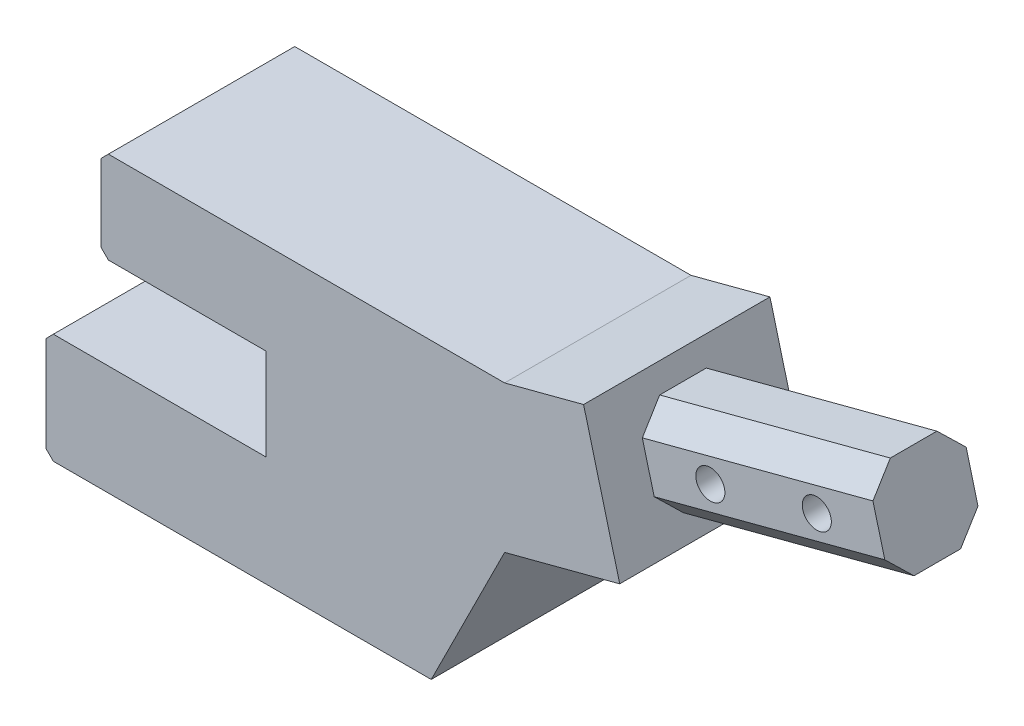
ISO-10303-21;
HEADER;
FILE_DESCRIPTION(('STEP AP214'),'2;1');
FILE_NAME('part.step','',(''),(''),'','','');
FILE_SCHEMA(('AUTOMOTIVE_DESIGN { 1 0 10303 214 1 1 1 1 }'));
ENDSEC;
DATA;
#1=APPLICATION_CONTEXT('core data for automotive mechanical design processes');
#2=APPLICATION_PROTOCOL_DEFINITION('international standard','automotive_design',2000,#1);
#3=PRODUCT_CONTEXT('',#1,'mechanical');
#4=PRODUCT('Part','Part','',(#3));
#5=PRODUCT_RELATED_PRODUCT_CATEGORY('part','',(#4));
#6=PRODUCT_DEFINITION_FORMATION('','',#4);
#7=PRODUCT_DEFINITION_CONTEXT('part definition',#1,'design');
#8=PRODUCT_DEFINITION('design','',#6,#7);
#9=PRODUCT_DEFINITION_SHAPE('','',#8);
#10=(LENGTH_UNIT() NAMED_UNIT(*) SI_UNIT(.MILLI.,.METRE.));
#11=(NAMED_UNIT(*) PLANE_ANGLE_UNIT() SI_UNIT($,.RADIAN.));
#12=(NAMED_UNIT(*) SI_UNIT($,.STERADIAN.) SOLID_ANGLE_UNIT());
#13=UNCERTAINTY_MEASURE_WITH_UNIT(LENGTH_MEASURE(1.E-05),#10,'distance_accuracy_value','');
#14=(GEOMETRIC_REPRESENTATION_CONTEXT(3) GLOBAL_UNCERTAINTY_ASSIGNED_CONTEXT((#13)) GLOBAL_UNIT_ASSIGNED_CONTEXT((#10,
#11,#12)) REPRESENTATION_CONTEXT('',''));
#15=CARTESIAN_POINT('',(0.,0.,0.));
#16=DIRECTION('',(0.,0.,1.));
#17=DIRECTION('',(1.,0.,0.));
#18=AXIS2_PLACEMENT_3D('',#15,#16,#17);
#19=CARTESIAN_POINT('',(0.,40.,25.4));
#20=DIRECTION('',(0.254493520450265,-0.967074479059824,0.));
#21=DIRECTION('',(0.967074479059824,0.254493520450265,0.));
#22=AXIS2_PLACEMENT_3D('',#19,#20,#21);
#23=PLANE('',#22);
#24=DIRECTION('',(-0.967074479059824,-0.254493520450265,0.));
#25=VECTOR('',#24,1.);
#26=CARTESIAN_POINT('',(0.,40.,-25.4));
#27=LINE('',#26,#25);
#28=CARTESIAN_POINT('',(21.5228,45.6639,-25.4));
#29=VERTEX_POINT('',#28);
#30=CARTESIAN_POINT('',(0.,40.,-25.4));
#31=VERTEX_POINT('',#30);
#32=EDGE_CURVE('E217',#29,#31,#27,.T.);
#33=ORIENTED_EDGE('',*,*,#32,.T.);
#34=DIRECTION('',(0.,0.,-1.));
#35=VECTOR('',#34,1.);
#36=CARTESIAN_POINT('',(0.,40.,25.4));
#37=LINE('',#36,#35);
#38=CARTESIAN_POINT('',(0.,40.,25.4));
#39=VERTEX_POINT('',#38);
#40=EDGE_CURVE('E198',#39,#31,#37,.T.);
#41=ORIENTED_EDGE('',*,*,#40,.F.);
#42=DIRECTION('',(-0.967074479059824,-0.254493520450265,0.));
#43=VECTOR('',#42,1.);
#44=CARTESIAN_POINT('',(0.,40.,25.4));
#45=LINE('',#44,#43);
#46=CARTESIAN_POINT('',(21.5228,45.6639,25.4));
#47=VERTEX_POINT('',#46);
#48=EDGE_CURVE('E205',#47,#39,#45,.T.);
#49=ORIENTED_EDGE('',*,*,#48,.F.);
#50=DIRECTION('',(0.,0.,-1.));
#51=VECTOR('',#50,1.);
#52=CARTESIAN_POINT('',(21.5228,45.6639,25.4));
#53=LINE('',#52,#51);
#54=EDGE_CURVE('E320',#47,#29,#53,.T.);
#55=ORIENTED_EDGE('',*,*,#54,.T.);
#56=EDGE_LOOP('',(#33,#41,#49,#55));
#57=FACE_BOUND('',#56,.T.);
#58=ADVANCED_FACE('F39',(#57),#23,.F.);
#59=CARTESIAN_POINT('',(-108.006473463206,40.,25.4));
#60=DIRECTION('',(0.,-1.,0.));
#61=DIRECTION('',(1.,0.,0.));
#62=AXIS2_PLACEMENT_3D('',#59,#60,#61);
#63=PLANE('',#62);
#64=DIRECTION('',(-1.,0.,0.));
#65=VECTOR('',#64,1.);
#66=CARTESIAN_POINT('',(-108.006473463206,40.,-25.4));
#67=LINE('',#66,#65);
#68=CARTESIAN_POINT('',(-108.006473463206,40.,-25.4));
#69=VERTEX_POINT('',#68);
#70=EDGE_CURVE('E322',#31,#69,#67,.T.);
#71=ORIENTED_EDGE('',*,*,#70,.T.);
#72=DIRECTION('',(0.,0.,-1.));
#73=VECTOR('',#72,1.);
#74=CARTESIAN_POINT('',(-108.006473463206,40.,25.4));
#75=LINE('',#74,#73);
#76=CARTESIAN_POINT('',(-108.006473463206,40.,25.4));
#77=VERTEX_POINT('',#76);
#78=EDGE_CURVE('E201',#77,#69,#75,.T.);
#79=ORIENTED_EDGE('',*,*,#78,.F.);
#80=DIRECTION('',(-1.,0.,0.));
#81=VECTOR('',#80,1.);
#82=CARTESIAN_POINT('',(-108.006473463206,40.,25.4));
#83=LINE('',#82,#81);
#84=EDGE_CURVE('E194',#39,#77,#83,.T.);
#85=ORIENTED_EDGE('',*,*,#84,.F.);
#86=ORIENTED_EDGE('',*,*,#40,.T.);
#87=EDGE_LOOP('',(#71,#79,#85,#86));
#88=FACE_BOUND('',#87,.T.);
#89=ADVANCED_FACE('F196',(#88),#63,.F.);
#90=CARTESIAN_POINT('',(-110.,37.9935265367935,25.4));
#91=DIRECTION('',(0.709391780114608,-0.704814374360957,0.));
#92=DIRECTION('',(0.704814374360957,0.709391780114608,0.));
#93=AXIS2_PLACEMENT_3D('',#90,#91,#92);
#94=PLANE('',#93);
#95=DIRECTION('',(-0.704814374360957,-0.709391780114608,0.));
#96=VECTOR('',#95,1.);
#97=CARTESIAN_POINT('',(-110.,37.9935265367935,-25.4));
#98=LINE('',#97,#96);
#99=CARTESIAN_POINT('',(-110.,37.9935265367935,-25.4));
#100=VERTEX_POINT('',#99);
#101=EDGE_CURVE('E324',#69,#100,#98,.T.);
#102=ORIENTED_EDGE('',*,*,#101,.T.);
#103=DIRECTION('',(0.,0.,-1.));
#104=VECTOR('',#103,1.);
#105=CARTESIAN_POINT('',(-110.,37.9935265367935,25.4));
#106=LINE('',#105,#104);
#107=CARTESIAN_POINT('',(-110.,37.9935265367935,25.4));
#108=VERTEX_POINT('',#107);
#109=EDGE_CURVE('E222',#108,#100,#106,.T.);
#110=ORIENTED_EDGE('',*,*,#109,.F.);
#111=DIRECTION('',(-0.704814374360957,-0.709391780114608,0.));
#112=VECTOR('',#111,1.);
#113=CARTESIAN_POINT('',(-110.,37.9935265367935,25.4));
#114=LINE('',#113,#112);
#115=EDGE_CURVE('E204',#77,#108,#114,.T.);
#116=ORIENTED_EDGE('',*,*,#115,.F.);
#117=ORIENTED_EDGE('',*,*,#78,.T.);
#118=EDGE_LOOP('',(#102,#110,#116,#117));
#119=FACE_BOUND('',#118,.T.);
#120=ADVANCED_FACE('F406',(#119),#94,.F.);
#121=CARTESIAN_POINT('',(-110.,16.9935265367937,25.4));
#122=DIRECTION('',(1.,0.,0.));
#123=DIRECTION('',(0.,0.,-1.));
#124=AXIS2_PLACEMENT_3D('',#121,#122,#123);
#125=PLANE('',#124);
#126=DIRECTION('',(0.,-1.,0.));
#127=VECTOR('',#126,1.);
#128=CARTESIAN_POINT('',(-110.,16.9935265367937,-25.4));
#129=LINE('',#128,#127);
#130=CARTESIAN_POINT('',(-110.,16.9935265367937,-25.4));
#131=VERTEX_POINT('',#130);
#132=EDGE_CURVE('E326',#100,#131,#129,.T.);
#133=ORIENTED_EDGE('',*,*,#132,.T.);
#134=DIRECTION('',(0.,0.,-1.));
#135=VECTOR('',#134,1.);
#136=CARTESIAN_POINT('',(-110.,16.9935265367937,25.4));
#137=LINE('',#136,#135);
#138=CARTESIAN_POINT('',(-110.,16.9935265367937,25.4));
#139=VERTEX_POINT('',#138);
#140=EDGE_CURVE('E380',#139,#131,#137,.T.);
#141=ORIENTED_EDGE('',*,*,#140,.F.);
#142=DIRECTION('',(0.,-1.,0.));
#143=VECTOR('',#142,1.);
#144=CARTESIAN_POINT('',(-110.,16.9935265367937,25.4));
#145=LINE('',#144,#143);
#146=EDGE_CURVE('E297',#108,#139,#145,.T.);
#147=ORIENTED_EDGE('',*,*,#146,.F.);
#148=ORIENTED_EDGE('',*,*,#109,.T.);
#149=EDGE_LOOP('',(#133,#141,#147,#148));
#150=FACE_BOUND('',#149,.T.);
#151=ADVANCED_FACE('F387',(#150),#125,.F.);
#152=CARTESIAN_POINT('',(-107.993526536793,15.,25.4));
#153=DIRECTION('',(0.704814374360958,0.709391780114607,0.));
#154=DIRECTION('',(-0.709391780114607,0.704814374360958,0.));
#155=AXIS2_PLACEMENT_3D('',#152,#153,#154);
#156=PLANE('',#155);
#157=DIRECTION('',(0.709391780114607,-0.704814374360958,0.));
#158=VECTOR('',#157,1.);
#159=CARTESIAN_POINT('',(-107.993526536793,15.,-25.4));
#160=LINE('',#159,#158);
#161=CARTESIAN_POINT('',(-107.993526536793,15.,-25.4));
#162=VERTEX_POINT('',#161);
#163=EDGE_CURVE('E328',#131,#162,#160,.T.);
#164=ORIENTED_EDGE('',*,*,#163,.T.);
#165=DIRECTION('',(0.,0.,-1.));
#166=VECTOR('',#165,1.);
#167=CARTESIAN_POINT('',(-107.993526536793,15.,25.4));
#168=LINE('',#167,#166);
#169=CARTESIAN_POINT('',(-107.993526536793,15.,25.4));
#170=VERTEX_POINT('',#169);
#171=EDGE_CURVE('E377',#170,#162,#168,.T.);
#172=ORIENTED_EDGE('',*,*,#171,.F.);
#173=DIRECTION('',(0.709391780114607,-0.704814374360958,0.));
#174=VECTOR('',#173,1.);
#175=CARTESIAN_POINT('',(-107.993526536793,15.,25.4));
#176=LINE('',#175,#174);
#177=EDGE_CURVE('E299',#139,#170,#176,.T.);
#178=ORIENTED_EDGE('',*,*,#177,.F.);
#179=ORIENTED_EDGE('',*,*,#140,.T.);
#180=EDGE_LOOP('',(#164,#172,#178,#179));
#181=FACE_BOUND('',#180,.T.);
#182=ADVANCED_FACE('F398',(#181),#156,.F.);
#183=CARTESIAN_POINT('',(-65.0000832715242,15.,25.4));
#184=DIRECTION('',(0.,1.,0.));
#185=DIRECTION('',(-1.,0.,0.));
#186=AXIS2_PLACEMENT_3D('',#183,#184,#185);
#187=PLANE('',#186);
#188=DIRECTION('',(1.,0.,0.));
#189=VECTOR('',#188,1.);
#190=CARTESIAN_POINT('',(-65.0000832715242,15.,-25.4));
#191=LINE('',#190,#189);
#192=CARTESIAN_POINT('',(-65.0000832715242,15.,-25.4));
#193=VERTEX_POINT('',#192);
#194=EDGE_CURVE('E330',#162,#193,#191,.T.);
#195=ORIENTED_EDGE('',*,*,#194,.T.);
#196=DIRECTION('',(0.,0.,-1.));
#197=VECTOR('',#196,1.);
#198=CARTESIAN_POINT('',(-65.0000832715242,15.,25.4));
#199=LINE('',#198,#197);
#200=CARTESIAN_POINT('',(-65.0000832715242,15.,25.4));
#201=VERTEX_POINT('',#200);
#202=EDGE_CURVE('E374',#201,#193,#199,.T.);
#203=ORIENTED_EDGE('',*,*,#202,.F.);
#204=DIRECTION('',(1.,0.,0.));
#205=VECTOR('',#204,1.);
#206=CARTESIAN_POINT('',(-65.0000832715242,15.,25.4));
#207=LINE('',#206,#205);
#208=EDGE_CURVE('E301',#170,#201,#207,.T.);
#209=ORIENTED_EDGE('',*,*,#208,.F.);
#210=ORIENTED_EDGE('',*,*,#171,.T.);
#211=EDGE_LOOP('',(#195,#203,#209,#210));
#212=FACE_BOUND('',#211,.T.);
#213=ADVANCED_FACE('F402',(#212),#187,.F.);
#214=CARTESIAN_POINT('',(-65.0000832715242,-10.,25.4));
#215=DIRECTION('',(1.,0.,0.));
#216=DIRECTION('',(0.,1.,0.));
#217=AXIS2_PLACEMENT_3D('',#214,#215,#216);
#218=PLANE('',#217);
#219=DIRECTION('',(0.,-1.,0.));
#220=VECTOR('',#219,1.);
#221=CARTESIAN_POINT('',(-65.0000832715242,-10.,-25.4));
#222=LINE('',#221,#220);
#223=CARTESIAN_POINT('',(-65.0000832715242,-10.,-25.4));
#224=VERTEX_POINT('',#223);
#225=EDGE_CURVE('E332',#193,#224,#222,.T.);
#226=ORIENTED_EDGE('',*,*,#225,.T.);
#227=DIRECTION('',(0.,0.,-1.));
#228=VECTOR('',#227,1.);
#229=CARTESIAN_POINT('',(-65.0000832715242,-10.,25.4));
#230=LINE('',#229,#228);
#231=CARTESIAN_POINT('',(-65.0000832715242,-10.,25.4));
#232=VERTEX_POINT('',#231);
#233=EDGE_CURVE('E371',#232,#224,#230,.T.);
#234=ORIENTED_EDGE('',*,*,#233,.F.);
#235=DIRECTION('',(0.,-1.,0.));
#236=VECTOR('',#235,1.);
#237=CARTESIAN_POINT('',(-65.0000832715242,-10.,25.4));
#238=LINE('',#237,#236);
#239=EDGE_CURVE('E303',#201,#232,#238,.T.);
#240=ORIENTED_EDGE('',*,*,#239,.F.);
#241=ORIENTED_EDGE('',*,*,#202,.T.);
#242=EDGE_LOOP('',(#226,#234,#240,#241));
#243=FACE_BOUND('',#242,.T.);
#244=ADVANCED_FACE('F521',(#243),#218,.F.);
#245=CARTESIAN_POINT('',(-123.000083271524,-10.,25.4));
#246=DIRECTION('',(0.,-1.,0.));
#247=DIRECTION('',(1.,0.,0.));
#248=AXIS2_PLACEMENT_3D('',#245,#246,#247);
#249=PLANE('',#248);
#250=DIRECTION('',(-1.,0.,0.));
#251=VECTOR('',#250,1.);
#252=CARTESIAN_POINT('',(-123.000083271524,-10.,-25.4));
#253=LINE('',#252,#251);
#254=CARTESIAN_POINT('',(-123.000083271524,-10.,-25.4));
#255=VERTEX_POINT('',#254);
#256=EDGE_CURVE('E334',#224,#255,#253,.T.);
#257=ORIENTED_EDGE('',*,*,#256,.T.);
#258=DIRECTION('',(0.,0.,-1.));
#259=VECTOR('',#258,1.);
#260=CARTESIAN_POINT('',(-123.000083271524,-10.,25.4));
#261=LINE('',#260,#259);
#262=CARTESIAN_POINT('',(-123.000083271524,-10.,25.4));
#263=VERTEX_POINT('',#262);
#264=EDGE_CURVE('E368',#263,#255,#261,.T.);
#265=ORIENTED_EDGE('',*,*,#264,.F.);
#266=DIRECTION('',(-1.,0.,0.));
#267=VECTOR('',#266,1.);
#268=CARTESIAN_POINT('',(-123.000083271524,-10.,25.4));
#269=LINE('',#268,#267);
#270=EDGE_CURVE('E305',#232,#263,#269,.T.);
#271=ORIENTED_EDGE('',*,*,#270,.F.);
#272=ORIENTED_EDGE('',*,*,#233,.T.);
#273=EDGE_LOOP('',(#257,#265,#271,#272));
#274=FACE_BOUND('',#273,.T.);
#275=ADVANCED_FACE('F517',(#274),#249,.F.);
#276=CARTESIAN_POINT('',(-125.,-12.012905155887,25.4));
#277=DIRECTION('',(0.709391780114603,-0.704814374360962,0.));
#278=DIRECTION('',(0.704814374360962,0.709391780114603,0.));
#279=AXIS2_PLACEMENT_3D('',#276,#277,#278);
#280=PLANE('',#279);
#281=DIRECTION('',(-0.704814374360962,-0.709391780114603,0.));
#282=VECTOR('',#281,1.);
#283=CARTESIAN_POINT('',(-125.,-12.012905155887,-25.4));
#284=LINE('',#283,#282);
#285=CARTESIAN_POINT('',(-125.,-12.012905155887,-25.4));
#286=VERTEX_POINT('',#285);
#287=EDGE_CURVE('E336',#255,#286,#284,.T.);
#288=ORIENTED_EDGE('',*,*,#287,.T.);
#289=DIRECTION('',(0.,0.,-1.));
#290=VECTOR('',#289,1.);
#291=CARTESIAN_POINT('',(-125.,-12.012905155887,25.4));
#292=LINE('',#291,#290);
#293=CARTESIAN_POINT('',(-125.,-12.012905155887,25.4));
#294=VERTEX_POINT('',#293);
#295=EDGE_CURVE('E365',#294,#286,#292,.T.);
#296=ORIENTED_EDGE('',*,*,#295,.F.);
#297=DIRECTION('',(-0.704814374360962,-0.709391780114603,0.));
#298=VECTOR('',#297,1.);
#299=CARTESIAN_POINT('',(-125.,-12.012905155887,25.4));
#300=LINE('',#299,#298);
#301=EDGE_CURVE('E307',#263,#294,#300,.T.);
#302=ORIENTED_EDGE('',*,*,#301,.F.);
#303=ORIENTED_EDGE('',*,*,#264,.T.);
#304=EDGE_LOOP('',(#288,#296,#302,#303));
#305=FACE_BOUND('',#304,.T.);
#306=ADVANCED_FACE('F513',(#305),#280,.F.);
#307=CARTESIAN_POINT('',(-125.,-38.012905155887,25.4));
#308=DIRECTION('',(1.,0.,0.));
#309=DIRECTION('',(0.,0.,-1.));
#310=AXIS2_PLACEMENT_3D('',#307,#308,#309);
#311=PLANE('',#310);
#312=DIRECTION('',(0.,-1.,0.));
#313=VECTOR('',#312,1.);
#314=CARTESIAN_POINT('',(-125.,-38.012905155887,-25.4));
#315=LINE('',#314,#313);
#316=CARTESIAN_POINT('',(-125.,-38.012905155887,-25.4));
#317=VERTEX_POINT('',#316);
#318=EDGE_CURVE('E338',#286,#317,#315,.T.);
#319=ORIENTED_EDGE('',*,*,#318,.T.);
#320=DIRECTION('',(0.,0.,-1.));
#321=VECTOR('',#320,1.);
#322=CARTESIAN_POINT('',(-125.,-38.012905155887,25.4));
#323=LINE('',#322,#321);
#324=CARTESIAN_POINT('',(-125.,-38.012905155887,25.4));
#325=VERTEX_POINT('',#324);
#326=EDGE_CURVE('E362',#325,#317,#323,.T.);
#327=ORIENTED_EDGE('',*,*,#326,.F.);
#328=DIRECTION('',(0.,-1.,0.));
#329=VECTOR('',#328,1.);
#330=CARTESIAN_POINT('',(-125.,-38.012905155887,25.4));
#331=LINE('',#330,#329);
#332=EDGE_CURVE('E309',#294,#325,#331,.T.);
#333=ORIENTED_EDGE('',*,*,#332,.F.);
#334=ORIENTED_EDGE('',*,*,#295,.T.);
#335=EDGE_LOOP('',(#319,#327,#333,#334));
#336=FACE_BOUND('',#335,.T.);
#337=ADVANCED_FACE('F509',(#336),#311,.F.);
#338=CARTESIAN_POINT('',(-123.,-40.,25.4));
#339=DIRECTION('',(0.704814374360949,0.709391780114616,0.));
#340=DIRECTION('',(-0.709391780114616,0.704814374360949,0.));
#341=AXIS2_PLACEMENT_3D('',#338,#339,#340);
#342=PLANE('',#341);
#343=DIRECTION('',(0.709391780114616,-0.704814374360949,0.));
#344=VECTOR('',#343,1.);
#345=CARTESIAN_POINT('',(-123.,-40.,-25.4));
#346=LINE('',#345,#344);
#347=CARTESIAN_POINT('',(-123.,-40.,-25.4));
#348=VERTEX_POINT('',#347);
#349=EDGE_CURVE('E340',#317,#348,#346,.T.);
#350=ORIENTED_EDGE('',*,*,#349,.T.);
#351=DIRECTION('',(0.,0.,-1.));
#352=VECTOR('',#351,1.);
#353=CARTESIAN_POINT('',(-123.,-40.,25.4));
#354=LINE('',#353,#352);
#355=CARTESIAN_POINT('',(-123.,-40.,25.4));
#356=VERTEX_POINT('',#355);
#357=EDGE_CURVE('E359',#356,#348,#354,.T.);
#358=ORIENTED_EDGE('',*,*,#357,.F.);
#359=DIRECTION('',(0.709391780114616,-0.704814374360949,0.));
#360=VECTOR('',#359,1.);
#361=CARTESIAN_POINT('',(-123.,-40.,25.4));
#362=LINE('',#361,#360);
#363=EDGE_CURVE('E311',#325,#356,#362,.T.);
#364=ORIENTED_EDGE('',*,*,#363,.F.);
#365=ORIENTED_EDGE('',*,*,#326,.T.);
#366=EDGE_LOOP('',(#350,#358,#364,#365));
#367=FACE_BOUND('',#366,.T.);
#368=ADVANCED_FACE('F505',(#367),#342,.F.);
#369=CARTESIAN_POINT('',(-20.,-40.,25.4));
#370=DIRECTION('',(0.,1.,0.));
#371=DIRECTION('',(-1.,0.,0.));
#372=AXIS2_PLACEMENT_3D('',#369,#370,#371);
#373=PLANE('',#372);
#374=DIRECTION('',(1.,0.,0.));
#375=VECTOR('',#374,1.);
#376=CARTESIAN_POINT('',(-20.,-40.,-25.4));
#377=LINE('',#376,#375);
#378=CARTESIAN_POINT('',(-20.,-40.,-25.4));
#379=VERTEX_POINT('',#378);
#380=EDGE_CURVE('E342',#348,#379,#377,.T.);
#381=ORIENTED_EDGE('',*,*,#380,.T.);
#382=DIRECTION('',(0.,0.,-1.));
#383=VECTOR('',#382,1.);
#384=CARTESIAN_POINT('',(-20.,-40.,25.4));
#385=LINE('',#384,#383);
#386=CARTESIAN_POINT('',(-20.,-40.,25.4));
#387=VERTEX_POINT('',#386);
#388=EDGE_CURVE('E356',#387,#379,#385,.T.);
#389=ORIENTED_EDGE('',*,*,#388,.F.);
#390=DIRECTION('',(1.,0.,0.));
#391=VECTOR('',#390,1.);
#392=CARTESIAN_POINT('',(-20.,-40.,25.4));
#393=LINE('',#392,#391);
#394=EDGE_CURVE('E313',#356,#387,#393,.T.);
#395=ORIENTED_EDGE('',*,*,#394,.F.);
#396=ORIENTED_EDGE('',*,*,#357,.T.);
#397=EDGE_LOOP('',(#381,#389,#395,#396));
#398=FACE_BOUND('',#397,.T.);
#399=ADVANCED_FACE('F501',(#398),#373,.F.);
#400=CARTESIAN_POINT('',(0.,0.,25.4));
#401=DIRECTION('',(-0.894427190999916,0.447213595499958,0.));
#402=DIRECTION('',(-0.447213595499958,-0.894427190999916,0.));
#403=AXIS2_PLACEMENT_3D('',#400,#401,#402);
#404=PLANE('',#403);
#405=DIRECTION('',(0.447213595499958,0.894427190999916,0.));
#406=VECTOR('',#405,1.);
#407=CARTESIAN_POINT('',(0.,0.,-25.4));
#408=LINE('',#407,#406);
#409=CARTESIAN_POINT('',(0.,0.,-25.4));
#410=VERTEX_POINT('',#409);
#411=EDGE_CURVE('E344',#379,#410,#408,.T.);
#412=ORIENTED_EDGE('',*,*,#411,.T.);
#413=DIRECTION('',(0.,0.,-1.));
#414=VECTOR('',#413,1.);
#415=CARTESIAN_POINT('',(0.,0.,25.4));
#416=LINE('',#415,#414);
#417=CARTESIAN_POINT('',(0.,0.,25.4));
#418=VERTEX_POINT('',#417);
#419=EDGE_CURVE('E353',#418,#410,#416,.T.);
#420=ORIENTED_EDGE('',*,*,#419,.F.);
#421=DIRECTION('',(0.447213595499958,0.894427190999916,0.));
#422=VECTOR('',#421,1.);
#423=CARTESIAN_POINT('',(0.,0.,25.4));
#424=LINE('',#423,#422);
#425=EDGE_CURVE('E315',#387,#418,#424,.T.);
#426=ORIENTED_EDGE('',*,*,#425,.F.);
#427=ORIENTED_EDGE('',*,*,#388,.T.);
#428=EDGE_LOOP('',(#412,#420,#426,#427));
#429=FACE_BOUND('',#428,.T.);
#430=ADVANCED_FACE('F497',(#429),#404,.F.);
#431=CARTESIAN_POINT('',(31.3673983712328,8.25458618928888,25.4));
#432=DIRECTION('',(-0.254493520450265,0.967074479059824,0.));
#433=DIRECTION('',(-0.967074479059824,-0.254493520450265,0.));
#434=AXIS2_PLACEMENT_3D('',#431,#432,#433);
#435=PLANE('',#434);
#436=DIRECTION('',(0.967074479059824,0.254493520450265,0.));
#437=VECTOR('',#436,1.);
#438=CARTESIAN_POINT('',(31.3673983712328,8.25458618928888,-25.4));
#439=LINE('',#438,#437);
#440=CARTESIAN_POINT('',(31.3673983712328,8.25458618928888,-25.4));
#441=VERTEX_POINT('',#440);
#442=EDGE_CURVE('E346',#410,#441,#439,.T.);
#443=ORIENTED_EDGE('',*,*,#442,.T.);
#444=DIRECTION('',(0.,0.,-1.));
#445=VECTOR('',#444,1.);
#446=CARTESIAN_POINT('',(31.3673983712328,8.25458618928888,25.4));
#447=LINE('',#446,#445);
#448=CARTESIAN_POINT('',(31.3673983712328,8.25458618928888,25.4));
#449=VERTEX_POINT('',#448);
#450=EDGE_CURVE('E350',#449,#441,#447,.T.);
#451=ORIENTED_EDGE('',*,*,#450,.F.);
#452=DIRECTION('',(0.967074479059824,0.254493520450265,0.));
#453=VECTOR('',#452,1.);
#454=CARTESIAN_POINT('',(31.3673983712328,8.25458618928888,25.4));
#455=LINE('',#454,#453);
#456=EDGE_CURVE('E317',#418,#449,#455,.T.);
#457=ORIENTED_EDGE('',*,*,#456,.F.);
#458=ORIENTED_EDGE('',*,*,#419,.T.);
#459=EDGE_LOOP('',(#443,#451,#457,#458));
#460=FACE_BOUND('',#459,.T.);
#461=ADVANCED_FACE('F494',(#460),#435,.F.);
#462=CARTESIAN_POINT('',(21.5228,45.6639,25.4));
#463=DIRECTION('',(-0.967074269374455,-0.254494317252593,0.));
#464=DIRECTION('',(0.254494317252593,-0.967074269374455,0.));
#465=AXIS2_PLACEMENT_3D('',#462,#463,#464);
#466=PLANE('',#465);
#467=DIRECTION('',(0.254494317252594,-0.967074269374455,0.));
#468=VECTOR('',#467,1.);
#469=CARTESIAN_POINT('',(23.2130213565085,39.2410863157,12.7));
#470=LINE('',#469,#468);
#471=CARTESIAN_POINT('',(24.8290602710624,33.1001647051723,12.7));
#472=VERTEX_POINT('',#471);
#473=CARTESIAN_POINT('',(28.0611381001704,20.8183214841167,12.7));
#474=VERTEX_POINT('',#473);
#475=EDGE_CURVE('E451',#472,#474,#470,.T.);
#476=ORIENTED_EDGE('',*,*,#475,.F.);
#477=DIRECTION('',(-0.179954657502749,0.683824773785704,-0.707106781186547));
#478=VECTOR('',#477,1.);
#479=CARTESIAN_POINT('',(24.7919690500852,33.2411107420584,12.5542552093985));
#480=LINE('',#479,#478);
#481=CARTESIAN_POINT('',(23.2130213565085,39.2410863157,6.35));
#482=VERTEX_POINT('',#481);
#483=EDGE_CURVE('E13',#472,#482,#480,.T.);
#484=ORIENTED_EDGE('',*,*,#483,.T.);
#485=DIRECTION('',(0.,0.,-1.));
#486=VECTOR('',#485,1.);
#487=CARTESIAN_POINT('',(23.2130213565085,39.2410863157,12.7));
#488=LINE('',#487,#486);
#489=CARTESIAN_POINT('',(23.2130213565085,39.2410863157,-6.34999999999999));
#490=VERTEX_POINT('',#489);
#491=EDGE_CURVE('E266',#482,#490,#488,.T.);
#492=ORIENTED_EDGE('',*,*,#491,.T.);
#493=DIRECTION('',(-0.179954657502749,0.683824773785703,0.707106781186547));
#494=VECTOR('',#493,1.);
#495=CARTESIAN_POINT('',(18.3278133918693,57.8047971841695,12.8457447906015));
#496=LINE('',#495,#494);
#497=CARTESIAN_POINT('',(24.8290602710624,33.1001647051723,-12.7));
#498=VERTEX_POINT('',#497);
#499=EDGE_CURVE('E48',#490,#498,#496,.F.);
#500=ORIENTED_EDGE('',*,*,#499,.T.);
#501=DIRECTION('',(0.254494317252594,-0.967074269374455,0.));
#502=VECTOR('',#501,1.);
#503=CARTESIAN_POINT('',(23.2130213565085,39.2410863157,-12.7));
#504=LINE('',#503,#502);
#505=CARTESIAN_POINT('',(28.0611381001704,20.8183214841167,-12.7));
#506=VERTEX_POINT('',#505);
#507=EDGE_CURVE('E232',#498,#506,#504,.T.);
#508=ORIENTED_EDGE('',*,*,#507,.T.);
#509=DIRECTION('',(-0.179954657502749,0.683824773785703,-0.707106781186548));
#510=VECTOR('',#509,1.);
#511=CARTESIAN_POINT('',(29.6400857937471,14.818345910475,-6.49574479060153));
#512=LINE('',#511,#510);
#513=CARTESIAN_POINT('',(29.6771770147244,14.6773998735889,-6.35));
#514=VERTEX_POINT('',#513);
#515=EDGE_CURVE('E258',#506,#514,#512,.F.);
#516=ORIENTED_EDGE('',*,*,#515,.T.);
#517=DIRECTION('',(0.,0.,-1.));
#518=VECTOR('',#517,1.);
#519=CARTESIAN_POINT('',(29.6771770147244,14.6773998735889,12.7));
#520=LINE('',#519,#518);
#521=CARTESIAN_POINT('',(29.6771770147244,14.6773998735889,6.35));
#522=VERTEX_POINT('',#521);
#523=EDGE_CURVE('E288',#522,#514,#520,.T.);
#524=ORIENTED_EDGE('',*,*,#523,.F.);
#525=DIRECTION('',(-0.179954657502749,0.683824773785703,0.707106781186547));
#526=VECTOR('',#525,1.);
#527=CARTESIAN_POINT('',(23.1759301355312,39.3820323525861,31.8957447906015));
#528=LINE('',#527,#526);
#529=EDGE_CURVE('E260',#522,#474,#528,.T.);
#530=ORIENTED_EDGE('',*,*,#529,.T.);
#531=EDGE_LOOP('',(#476,#484,#492,#500,#508,#516,#524,#530));
#532=FACE_BOUND('',#531,.T.);
#533=DIRECTION('',(-0.254494317252593,0.967074269374455,0.));
#534=VECTOR('',#533,1.);
#535=CARTESIAN_POINT('',(21.5228,45.6639,-25.4));
#536=LINE('',#535,#534);
#537=EDGE_CURVE('E214',#441,#29,#536,.T.);
#538=ORIENTED_EDGE('',*,*,#537,.T.);
#539=ORIENTED_EDGE('',*,*,#54,.F.);
#540=DIRECTION('',(-0.254494317252593,0.967074269374455,0.));
#541=VECTOR('',#540,1.);
#542=CARTESIAN_POINT('',(21.5228,45.6639,25.4));
#543=LINE('',#542,#541);
#544=EDGE_CURVE('E210',#449,#47,#543,.T.);
#545=ORIENTED_EDGE('',*,*,#544,.F.);
#546=ORIENTED_EDGE('',*,*,#450,.T.);
#547=EDGE_LOOP('',(#538,#539,#545,#546));
#548=FACE_BOUND('',#547,.T.);
#549=ADVANCED_FACE('F263',(#532,#548),#466,.F.);
#550=CARTESIAN_POINT('',(0.,0.,25.4));
#551=DIRECTION('',(0.,0.,-1.));
#552=DIRECTION('',(-1.,0.,0.));
#553=AXIS2_PLACEMENT_3D('',#550,#551,#552);
#554=PLANE('',#553);
#555=ORIENTED_EDGE('',*,*,#48,.T.);
#556=ORIENTED_EDGE('',*,*,#84,.T.);
#557=ORIENTED_EDGE('',*,*,#115,.T.);
#558=ORIENTED_EDGE('',*,*,#146,.T.);
#559=ORIENTED_EDGE('',*,*,#177,.T.);
#560=ORIENTED_EDGE('',*,*,#208,.T.);
#561=ORIENTED_EDGE('',*,*,#239,.T.);
#562=ORIENTED_EDGE('',*,*,#270,.T.);
#563=ORIENTED_EDGE('',*,*,#301,.T.);
#564=ORIENTED_EDGE('',*,*,#332,.T.);
#565=ORIENTED_EDGE('',*,*,#363,.T.);
#566=ORIENTED_EDGE('',*,*,#394,.T.);
#567=ORIENTED_EDGE('',*,*,#425,.T.);
#568=ORIENTED_EDGE('',*,*,#456,.T.);
#569=ORIENTED_EDGE('',*,*,#544,.T.);
#570=EDGE_LOOP('',(#555,#556,#557,#558,#559,#560,#561,#562,#563,#564,#565,#566,#567,#568,#569));
#571=FACE_BOUND('',#570,.T.);
#572=ADVANCED_FACE('F208',(#571),#554,.F.);
#573=CARTESIAN_POINT('',(0.,0.,-25.4));
#574=DIRECTION('',(0.,0.,-1.));
#575=DIRECTION('',(-1.,0.,0.));
#576=AXIS2_PLACEMENT_3D('',#573,#574,#575);
#577=PLANE('',#576);
#578=ORIENTED_EDGE('',*,*,#32,.F.);
#579=ORIENTED_EDGE('',*,*,#537,.F.);
#580=ORIENTED_EDGE('',*,*,#442,.F.);
#581=ORIENTED_EDGE('',*,*,#411,.F.);
#582=ORIENTED_EDGE('',*,*,#380,.F.);
#583=ORIENTED_EDGE('',*,*,#349,.F.);
#584=ORIENTED_EDGE('',*,*,#318,.F.);
#585=ORIENTED_EDGE('',*,*,#287,.F.);
#586=ORIENTED_EDGE('',*,*,#256,.F.);
#587=ORIENTED_EDGE('',*,*,#225,.F.);
#588=ORIENTED_EDGE('',*,*,#194,.F.);
#589=ORIENTED_EDGE('',*,*,#163,.F.);
#590=ORIENTED_EDGE('',*,*,#132,.F.);
#591=ORIENTED_EDGE('',*,*,#101,.F.);
#592=ORIENTED_EDGE('',*,*,#70,.F.);
#593=EDGE_LOOP('',(#578,#579,#580,#581,#582,#583,#584,#585,#586,#587,#588,#589,#590,#591,#592));
#594=FACE_BOUND('',#593,.T.);
#595=ADVANCED_FACE('F393',(#594),#577,.T.);
#596=CARTESIAN_POINT('',(29.6771770147244,14.6773998735889,12.7));
#597=DIRECTION('',(-0.254494317252593,0.967074269374455,0.));
#598=DIRECTION('',(-0.967074269374455,-0.254494317252593,0.));
#599=AXIS2_PLACEMENT_3D('',#596,#597,#598);
#600=PLANE('',#599);
#601=ORIENTED_EDGE('',*,*,#523,.T.);
#602=DIRECTION('',(0.967074269374455,0.254494317252593,0.));
#603=VECTOR('',#602,1.);
#604=CARTESIAN_POINT('',(29.6771770147244,14.6773998735889,-6.35));
#605=LINE('',#604,#603);
#606=CARTESIAN_POINT('',(92.5370045240639,31.2195304950074,-6.35));
#607=VERTEX_POINT('',#606);
#608=EDGE_CURVE('E220',#514,#607,#605,.T.);
#609=ORIENTED_EDGE('',*,*,#608,.T.);
#610=DIRECTION('',(0.,0.,-1.));
#611=VECTOR('',#610,1.);
#612=CARTESIAN_POINT('',(92.5370045240639,31.2195304950074,12.7));
#613=LINE('',#612,#611);
#614=CARTESIAN_POINT('',(92.5370045240639,31.2195304950074,6.35));
#615=VERTEX_POINT('',#614);
#616=EDGE_CURVE('E286',#615,#607,#613,.T.);
#617=ORIENTED_EDGE('',*,*,#616,.F.);
#618=DIRECTION('',(-0.967074269374455,-0.254494317252593,0.));
#619=VECTOR('',#618,1.);
#620=CARTESIAN_POINT('',(29.6771770147244,14.6773998735889,6.35));
#621=LINE('',#620,#619);
#622=EDGE_CURVE('E218',#615,#522,#621,.T.);
#623=ORIENTED_EDGE('',*,*,#622,.T.);
#624=EDGE_LOOP('',(#601,#609,#617,#623));
#625=FACE_BOUND('',#624,.T.);
#626=ADVANCED_FACE('F484',(#625),#600,.F.);
#627=CARTESIAN_POINT('',(92.5370045240639,31.2195304950074,12.7));
#628=DIRECTION('',(-0.967074269374455,-0.254494317252594,0.));
#629=DIRECTION('',(0.254494317252594,-0.967074269374455,0.));
#630=AXIS2_PLACEMENT_3D('',#627,#628,#629);
#631=PLANE('',#630);
#632=ORIENTED_EDGE('',*,*,#616,.T.);
#633=DIRECTION('',(0.17995465750275,-0.683824773785703,0.707106781186548));
#634=VECTOR('',#633,1.);
#635=CARTESIAN_POINT('',(92.537004524064,31.2195304950075,-6.35000000000002));
#636=LINE('',#635,#634);
#637=CARTESIAN_POINT('',(90.92096560951,37.3604521055352,-12.7));
#638=VERTEX_POINT('',#637);
#639=EDGE_CURVE('E242',#607,#638,#636,.F.);
#640=ORIENTED_EDGE('',*,*,#639,.T.);
#641=DIRECTION('',(-0.254494317252594,0.967074269374455,0.));
#642=VECTOR('',#641,1.);
#643=CARTESIAN_POINT('',(92.5370045240639,31.2195304950074,-12.7));
#644=LINE('',#643,#642);
#645=CARTESIAN_POINT('',(87.688887780402,49.6422953265908,-12.7));
#646=VERTEX_POINT('',#645);
#647=EDGE_CURVE('E272',#638,#646,#644,.T.);
#648=ORIENTED_EDGE('',*,*,#647,.T.);
#649=DIRECTION('',(0.17995465750275,-0.683824773785703,-0.707106781186547));
#650=VECTOR('',#649,1.);
#651=CARTESIAN_POINT('',(86.0728488658481,55.7832169371186,-6.35));
#652=LINE('',#651,#650);
#653=CARTESIAN_POINT('',(86.0728488658481,55.7832169371186,-6.34999999999999));
#654=VERTEX_POINT('',#653);
#655=EDGE_CURVE('E238',#646,#654,#652,.F.);
#656=ORIENTED_EDGE('',*,*,#655,.T.);
#657=DIRECTION('',(0.,0.,-1.));
#658=VECTOR('',#657,1.);
#659=CARTESIAN_POINT('',(86.0728488658481,55.7832169371186,12.7));
#660=LINE('',#659,#658);
#661=CARTESIAN_POINT('',(86.0728488658481,55.7832169371186,6.35));
#662=VERTEX_POINT('',#661);
#663=EDGE_CURVE('E281',#662,#654,#660,.T.);
#664=ORIENTED_EDGE('',*,*,#663,.F.);
#665=DIRECTION('',(0.17995465750275,-0.683824773785703,0.707106781186547));
#666=VECTOR('',#665,1.);
#667=CARTESIAN_POINT('',(87.688887780402,49.6422953265908,12.7));
#668=LINE('',#667,#666);
#669=CARTESIAN_POINT('',(87.688887780402,49.6422953265908,12.7));
#670=VERTEX_POINT('',#669);
#671=EDGE_CURVE('E236',#662,#670,#668,.T.);
#672=ORIENTED_EDGE('',*,*,#671,.T.);
#673=DIRECTION('',(-0.254494317252594,0.967074269374455,0.));
#674=VECTOR('',#673,1.);
#675=CARTESIAN_POINT('',(92.5370045240639,31.2195304950074,12.7));
#676=LINE('',#675,#674);
#677=CARTESIAN_POINT('',(90.92096560951,37.3604521055352,12.7));
#678=VERTEX_POINT('',#677);
#679=EDGE_CURVE('E290',#678,#670,#676,.T.);
#680=ORIENTED_EDGE('',*,*,#679,.F.);
#681=DIRECTION('',(0.17995465750275,-0.683824773785703,-0.707106781186547));
#682=VECTOR('',#681,1.);
#683=CARTESIAN_POINT('',(90.92096560951,37.3604521055353,12.7));
#684=LINE('',#683,#682);
#685=EDGE_CURVE('E240',#678,#615,#684,.T.);
#686=ORIENTED_EDGE('',*,*,#685,.T.);
#687=EDGE_LOOP('',(#632,#640,#648,#656,#664,#672,#680,#686));
#688=FACE_BOUND('',#687,.T.);
#689=ADVANCED_FACE('F280',(#688),#631,.F.);
#690=CARTESIAN_POINT('',(86.0728488658481,55.7832169371186,12.7));
#691=DIRECTION('',(0.254494317252593,-0.967074269374455,0.));
#692=DIRECTION('',(0.967074269374455,0.254494317252593,0.));
#693=AXIS2_PLACEMENT_3D('',#690,#691,#692);
#694=PLANE('',#693);
#695=ORIENTED_EDGE('',*,*,#663,.T.);
#696=DIRECTION('',(-0.967074269374455,-0.254494317252593,0.));
#697=VECTOR('',#696,1.);
#698=CARTESIAN_POINT('',(86.0728488658481,55.7832169371186,-6.34999999999999));
#699=LINE('',#698,#697);
#700=EDGE_CURVE('E256',#654,#490,#699,.T.);
#701=ORIENTED_EDGE('',*,*,#700,.T.);
#702=ORIENTED_EDGE('',*,*,#491,.F.);
#703=DIRECTION('',(0.967074269374455,0.254494317252593,0.));
#704=VECTOR('',#703,1.);
#705=CARTESIAN_POINT('',(86.0728488658481,55.7832169371186,6.35));
#706=LINE('',#705,#704);
#707=EDGE_CURVE('E254',#482,#662,#706,.T.);
#708=ORIENTED_EDGE('',*,*,#707,.T.);
#709=EDGE_LOOP('',(#695,#701,#702,#708));
#710=FACE_BOUND('',#709,.T.);
#711=ADVANCED_FACE('F284',(#710),#694,.F.);
#712=CARTESIAN_POINT('',(0.,0.,12.7));
#713=DIRECTION('',(0.,0.,1.));
#714=DIRECTION('',(1.,0.,0.));
#715=AXIS2_PLACEMENT_3D('',#712,#713,#714);
#716=PLANE('',#715);
#717=CARTESIAN_POINT('',(72.381126980903,39.0477231641426,12.7));
#718=DIRECTION('',(0.,0.,1.));
#719=DIRECTION('',(1.,0.,0.));
#720=AXIS2_PLACEMENT_3D('',#717,#718,#719);
#721=CIRCLE('',#720,3.96874999999999);
#722=CARTESIAN_POINT('',(76.349876980903,39.0477231641426,12.7));
#723=VERTEX_POINT('',#722);
#724=EDGE_CURVE('E230',#723,#723,#721,.T.);
#725=ORIENTED_EDGE('',*,*,#724,.F.);
#726=EDGE_LOOP('',(#725));
#727=FACE_BOUND('',#726,.T.);
#728=CARTESIAN_POINT('',(43.3688988996694,31.4128936465648,12.7));
#729=DIRECTION('',(0.,0.,1.));
#730=DIRECTION('',(1.,0.,0.));
#731=AXIS2_PLACEMENT_3D('',#728,#729,#730);
#732=CIRCLE('',#731,3.96875);
#733=CARTESIAN_POINT('',(47.3376488996694,31.4128936465648,12.7));
#734=VERTEX_POINT('',#733);
#735=EDGE_CURVE('E455',#734,#734,#732,.T.);
#736=ORIENTED_EDGE('',*,*,#735,.F.);
#737=EDGE_LOOP('',(#736));
#738=FACE_BOUND('',#737,.T.);
#739=ORIENTED_EDGE('',*,*,#475,.T.);
#740=DIRECTION('',(0.967074269374455,0.254494317252593,0.));
#741=VECTOR('',#740,1.);
#742=CARTESIAN_POINT('',(90.92096560951,37.3604521055352,12.7));
#743=LINE('',#742,#741);
#744=EDGE_CURVE('E251',#474,#678,#743,.T.);
#745=ORIENTED_EDGE('',*,*,#744,.T.);
#746=ORIENTED_EDGE('',*,*,#679,.T.);
#747=DIRECTION('',(-0.967074269374455,-0.254494317252593,0.));
#748=VECTOR('',#747,1.);
#749=CARTESIAN_POINT('',(24.8290602710624,33.1001647051723,12.7));
#750=LINE('',#749,#748);
#751=EDGE_CURVE('E248',#670,#472,#750,.T.);
#752=ORIENTED_EDGE('',*,*,#751,.T.);
#753=EDGE_LOOP('',(#739,#745,#746,#752));
#754=FACE_BOUND('',#753,.T.);
#755=ADVANCED_FACE('F449',(#727,#738,#754),#716,.T.);
#756=CARTESIAN_POINT('',(0.,0.,-12.7));
#757=DIRECTION('',(0.,0.,1.));
#758=DIRECTION('',(1.,0.,0.));
#759=AXIS2_PLACEMENT_3D('',#756,#757,#758);
#760=PLANE('',#759);
#761=CARTESIAN_POINT('',(72.381126980903,39.0477231641426,-12.7));
#762=DIRECTION('',(0.,0.,1.));
#763=DIRECTION('',(1.,0.,0.));
#764=AXIS2_PLACEMENT_3D('',#761,#762,#763);
#765=CIRCLE('',#764,3.96874999999999);
#766=CARTESIAN_POINT('',(76.349876980903,39.0477231641426,-12.7));
#767=VERTEX_POINT('',#766);
#768=EDGE_CURVE('E229',#767,#767,#765,.T.);
#769=ORIENTED_EDGE('',*,*,#768,.T.);
#770=EDGE_LOOP('',(#769));
#771=FACE_BOUND('',#770,.T.);
#772=CARTESIAN_POINT('',(43.3688988996694,31.4128936465648,-12.7));
#773=DIRECTION('',(0.,0.,1.));
#774=DIRECTION('',(1.,0.,0.));
#775=AXIS2_PLACEMENT_3D('',#772,#773,#774);
#776=CIRCLE('',#775,3.96875);
#777=CARTESIAN_POINT('',(47.3376488996694,31.4128936465648,-12.7));
#778=VERTEX_POINT('',#777);
#779=EDGE_CURVE('E226',#778,#778,#776,.T.);
#780=ORIENTED_EDGE('',*,*,#779,.T.);
#781=EDGE_LOOP('',(#780));
#782=FACE_BOUND('',#781,.T.);
#783=ORIENTED_EDGE('',*,*,#647,.F.);
#784=DIRECTION('',(-0.967074269374455,-0.254494317252593,0.));
#785=VECTOR('',#784,1.);
#786=CARTESIAN_POINT('',(-3.30625346983365,12.5637094502689,-12.7));
#787=LINE('',#786,#785);
#788=EDGE_CURVE('E246',#638,#506,#787,.T.);
#789=ORIENTED_EDGE('',*,*,#788,.T.);
#790=ORIENTED_EDGE('',*,*,#507,.F.);
#791=DIRECTION('',(0.967074269374455,0.254494317252593,0.));
#792=VECTOR('',#791,1.);
#793=CARTESIAN_POINT('',(-6.53833129894159,24.8455526713245,-12.7));
#794=LINE('',#793,#792);
#795=EDGE_CURVE('E244',#498,#646,#794,.T.);
#796=ORIENTED_EDGE('',*,*,#795,.T.);
#797=EDGE_LOOP('',(#783,#789,#790,#796));
#798=FACE_BOUND('',#797,.T.);
#799=ADVANCED_FACE('F269',(#771,#782,#798),#760,.F.);
#800=CARTESIAN_POINT('',(43.3688988996694,31.4128936465648,-25.4));
#801=DIRECTION('',(0.,0.,1.));
#802=DIRECTION('',(1.,0.,0.));
#803=AXIS2_PLACEMENT_3D('',#800,#801,#802);
#804=CYLINDRICAL_SURFACE('',#803,3.96875);
#805=ORIENTED_EDGE('',*,*,#735,.T.);
#806=EDGE_LOOP('',(#805));
#807=FACE_BOUND('',#806,.T.);
#808=ORIENTED_EDGE('',*,*,#779,.F.);
#809=EDGE_LOOP('',(#808));
#810=FACE_BOUND('',#809,.T.);
#811=ADVANCED_FACE('F468',(#807,#810),#804,.F.);
#812=CARTESIAN_POINT('',(72.381126980903,39.0477231641426,-25.4));
#813=DIRECTION('',(0.,0.,1.));
#814=DIRECTION('',(1.,0.,0.));
#815=AXIS2_PLACEMENT_3D('',#812,#813,#814);
#816=CYLINDRICAL_SURFACE('',#815,3.96874999999999);
#817=ORIENTED_EDGE('',*,*,#724,.T.);
#818=EDGE_LOOP('',(#817));
#819=FACE_BOUND('',#818,.T.);
#820=ORIENTED_EDGE('',*,*,#768,.F.);
#821=EDGE_LOOP('',(#820));
#822=FACE_BOUND('',#821,.T.);
#823=ADVANCED_FACE('F428',(#819,#822),#816,.F.);
#824=CARTESIAN_POINT('',(29.6771770147244,14.6773998735889,-6.35));
#825=DIRECTION('',(-0.179954657502749,0.683824773785703,0.707106781186547));
#826=DIRECTION('',(0.967074269374455,0.254494317252593,0.));
#827=AXIS2_PLACEMENT_3D('',#824,#825,#826);
#828=PLANE('',#827);
#829=ORIENTED_EDGE('',*,*,#515,.F.);
#830=ORIENTED_EDGE('',*,*,#788,.F.);
#831=ORIENTED_EDGE('',*,*,#639,.F.);
#832=ORIENTED_EDGE('',*,*,#608,.F.);
#833=EDGE_LOOP('',(#829,#830,#831,#832));
#834=FACE_BOUND('',#833,.T.);
#835=ADVANCED_FACE('F421',(#834),#828,.F.);
#836=CARTESIAN_POINT('',(-3.30625346983365,12.5637094502689,12.7));
#837=DIRECTION('',(0.179954657502749,-0.683824773785703,0.707106781186547));
#838=DIRECTION('',(-0.967074269374455,-0.254494317252593,0.));
#839=AXIS2_PLACEMENT_3D('',#836,#837,#838);
#840=PLANE('',#839);
#841=ORIENTED_EDGE('',*,*,#529,.F.);
#842=ORIENTED_EDGE('',*,*,#622,.F.);
#843=ORIENTED_EDGE('',*,*,#685,.F.);
#844=ORIENTED_EDGE('',*,*,#744,.F.);
#845=EDGE_LOOP('',(#841,#842,#843,#844));
#846=FACE_BOUND('',#845,.T.);
#847=ADVANCED_FACE('F427',(#846),#840,.T.);
#848=CARTESIAN_POINT('',(86.0728488658481,55.7832169371186,-6.35));
#849=DIRECTION('',(0.179954657502749,-0.683824773785703,0.707106781186548));
#850=DIRECTION('',(-0.967074269374455,-0.254494317252593,0.));
#851=AXIS2_PLACEMENT_3D('',#848,#849,#850);
#852=PLANE('',#851);
#853=ORIENTED_EDGE('',*,*,#655,.F.);
#854=ORIENTED_EDGE('',*,*,#795,.F.);
#855=ORIENTED_EDGE('',*,*,#499,.F.);
#856=ORIENTED_EDGE('',*,*,#700,.F.);
#857=EDGE_LOOP('',(#853,#854,#855,#856));
#858=FACE_BOUND('',#857,.T.);
#859=ADVANCED_FACE('F275',(#858),#852,.F.);
#860=CARTESIAN_POINT('',(-6.53833129894159,24.8455526713245,12.7));
#861=DIRECTION('',(-0.179954657502749,0.683824773785703,0.707106781186548));
#862=DIRECTION('',(0.967074269374455,0.254494317252593,0.));
#863=AXIS2_PLACEMENT_3D('',#860,#861,#862);
#864=PLANE('',#863);
#865=ORIENTED_EDGE('',*,*,#671,.F.);
#866=ORIENTED_EDGE('',*,*,#707,.F.);
#867=ORIENTED_EDGE('',*,*,#483,.F.);
#868=ORIENTED_EDGE('',*,*,#751,.F.);
#869=EDGE_LOOP('',(#865,#866,#867,#868));
#870=FACE_BOUND('',#869,.T.);
#871=ADVANCED_FACE('F42',(#870),#864,.T.);
#872=CLOSED_SHELL('',(#58,#89,#120,#151,#182,#213,#244,#275,#306,#337,#368,#399,#430,#461,#549,
#572,#595,#626,#689,#711,#755,#799,#811,#823,#835,#847,#859,#871));
#873=MANIFOLD_SOLID_BREP('B2',#872);
#874=ADVANCED_BREP_SHAPE_REPRESENTATION('',(#18,#873),#14);
#875=SHAPE_DEFINITION_REPRESENTATION(#9,#874);
ENDSEC;
END-ISO-10303-21;
